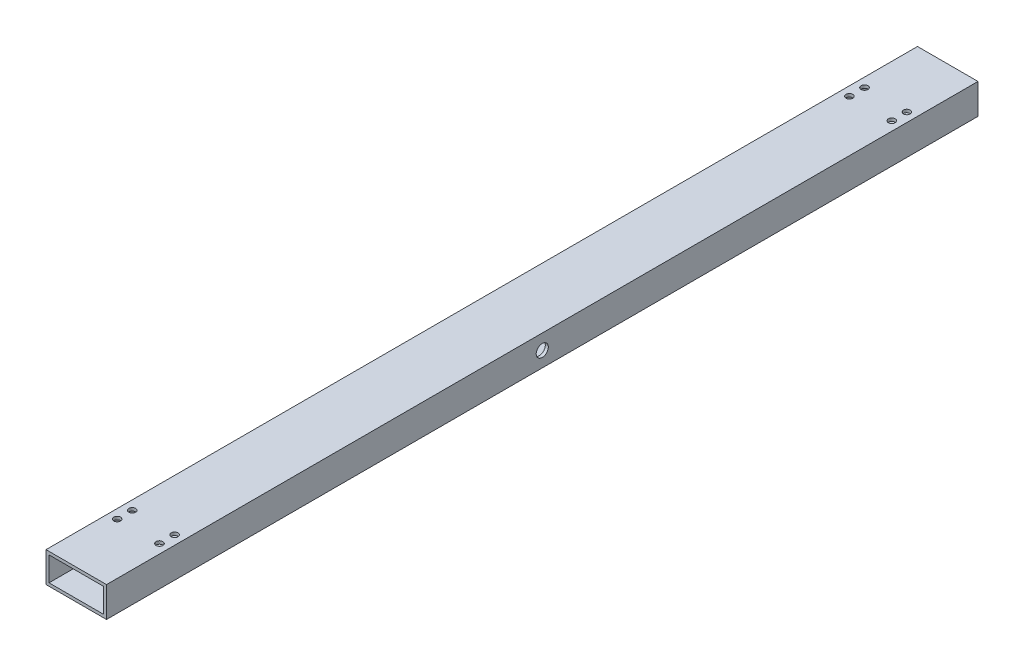
ISO-10303-21;
HEADER;
FILE_DESCRIPTION(('STEP AP214'),'2;1');
FILE_NAME('part.step','',(''),(''),'','','');
FILE_SCHEMA(('AUTOMOTIVE_DESIGN { 1 0 10303 214 1 1 1 1 }'));
ENDSEC;
DATA;
#1=APPLICATION_CONTEXT('core data for automotive mechanical design processes');
#2=APPLICATION_PROTOCOL_DEFINITION('international standard','automotive_design',2000,#1);
#3=PRODUCT_CONTEXT('',#1,'mechanical');
#4=PRODUCT('Part','Part','',(#3));
#5=PRODUCT_RELATED_PRODUCT_CATEGORY('part','',(#4));
#6=PRODUCT_DEFINITION_FORMATION('','',#4);
#7=PRODUCT_DEFINITION_CONTEXT('part definition',#1,'design');
#8=PRODUCT_DEFINITION('design','',#6,#7);
#9=PRODUCT_DEFINITION_SHAPE('','',#8);
#10=(LENGTH_UNIT() NAMED_UNIT(*) SI_UNIT(.MILLI.,.METRE.));
#11=(NAMED_UNIT(*) PLANE_ANGLE_UNIT() SI_UNIT($,.RADIAN.));
#12=(NAMED_UNIT(*) SI_UNIT($,.STERADIAN.) SOLID_ANGLE_UNIT());
#13=UNCERTAINTY_MEASURE_WITH_UNIT(LENGTH_MEASURE(1.E-05),#10,'distance_accuracy_value','');
#14=(GEOMETRIC_REPRESENTATION_CONTEXT(3) GLOBAL_UNCERTAINTY_ASSIGNED_CONTEXT((#13)) GLOBAL_UNIT_ASSIGNED_CONTEXT((#10,
#11,#12)) REPRESENTATION_CONTEXT('',''));
#15=CARTESIAN_POINT('',(0.,0.,0.));
#16=DIRECTION('',(0.,0.,1.));
#17=DIRECTION('',(1.,0.,0.));
#18=AXIS2_PLACEMENT_3D('',#15,#16,#17);
#19=CARTESIAN_POINT('',(-31.7499999999999,15.875,457.2));
#20=DIRECTION('',(0.,-1.,0.));
#21=DIRECTION('',(1.,0.,0.));
#22=AXIS2_PLACEMENT_3D('',#19,#20,#21);
#23=PLANE('',#22);
#24=CARTESIAN_POINT('',(-22.2250000000001,15.875,-376.2375));
#25=DIRECTION('',(0.,-1.,0.));
#26=DIRECTION('',(0.,0.,-1.));
#27=AXIS2_PLACEMENT_3D('',#24,#25,#26);
#28=CIRCLE('',#27,3.57187499999998);
#29=CARTESIAN_POINT('',(-22.2250000000001,15.875,-379.809375));
#30=VERTEX_POINT('',#29);
#31=EDGE_CURVE('E278',#30,#30,#28,.T.);
#32=ORIENTED_EDGE('',*,*,#31,.T.);
#33=EDGE_LOOP('',(#32));
#34=FACE_BOUND('',#33,.T.);
#35=CARTESIAN_POINT('',(22.2249999999999,15.875,392.1125));
#36=DIRECTION('',(0.,-1.,0.));
#37=DIRECTION('',(0.,0.,-1.));
#38=AXIS2_PLACEMENT_3D('',#35,#36,#37);
#39=CIRCLE('',#38,3.57187499999998);
#40=CARTESIAN_POINT('',(22.2249999999999,15.875,388.540625));
#41=VERTEX_POINT('',#40);
#42=EDGE_CURVE('E271',#41,#41,#39,.T.);
#43=ORIENTED_EDGE('',*,*,#42,.T.);
#44=EDGE_LOOP('',(#43));
#45=FACE_BOUND('',#44,.T.);
#46=CARTESIAN_POINT('',(22.2249999999999,15.875,-376.2375));
#47=DIRECTION('',(0.,-1.,0.));
#48=DIRECTION('',(0.,0.,-1.));
#49=AXIS2_PLACEMENT_3D('',#46,#47,#48);
#50=CIRCLE('',#49,3.57187499999998);
#51=CARTESIAN_POINT('',(22.2249999999999,15.875,-379.809375));
#52=VERTEX_POINT('',#51);
#53=EDGE_CURVE('E307',#52,#52,#50,.T.);
#54=ORIENTED_EDGE('',*,*,#53,.T.);
#55=EDGE_LOOP('',(#54));
#56=FACE_BOUND('',#55,.T.);
#57=CARTESIAN_POINT('',(-22.2250000000001,15.875,392.1125));
#58=DIRECTION('',(0.,-1.,0.));
#59=DIRECTION('',(0.,0.,-1.));
#60=AXIS2_PLACEMENT_3D('',#57,#58,#59);
#61=CIRCLE('',#60,3.57187499999998);
#62=CARTESIAN_POINT('',(-22.2250000000001,15.875,388.540625));
#63=VERTEX_POINT('',#62);
#64=EDGE_CURVE('E206',#63,#63,#61,.T.);
#65=ORIENTED_EDGE('',*,*,#64,.T.);
#66=EDGE_LOOP('',(#65));
#67=FACE_BOUND('',#66,.T.);
#68=DIRECTION('',(0.,0.,-1.));
#69=VECTOR('',#68,1.);
#70=CARTESIAN_POINT('',(31.75,15.875,457.2));
#71=LINE('',#70,#69);
#72=CARTESIAN_POINT('',(31.75,15.875,457.2));
#73=VERTEX_POINT('',#72);
#74=CARTESIAN_POINT('',(31.75,15.875,-457.2));
#75=VERTEX_POINT('',#74);
#76=EDGE_CURVE('E11',#73,#75,#71,.T.);
#77=ORIENTED_EDGE('',*,*,#76,.T.);
#78=DIRECTION('',(-1.,0.,0.));
#79=VECTOR('',#78,1.);
#80=CARTESIAN_POINT('',(-31.7499999999999,15.875,-457.2));
#81=LINE('',#80,#79);
#82=CARTESIAN_POINT('',(-31.7499999999999,15.875,-457.2));
#83=VERTEX_POINT('',#82);
#84=EDGE_CURVE('E156',#75,#83,#81,.T.);
#85=ORIENTED_EDGE('',*,*,#84,.T.);
#86=DIRECTION('',(0.,0.,-1.));
#87=VECTOR('',#86,1.);
#88=CARTESIAN_POINT('',(-31.7499999999999,15.875,457.2));
#89=LINE('',#88,#87);
#90=CARTESIAN_POINT('',(-31.7499999999999,15.875,457.2));
#91=VERTEX_POINT('',#90);
#92=EDGE_CURVE('E50',#91,#83,#89,.T.);
#93=ORIENTED_EDGE('',*,*,#92,.F.);
#94=DIRECTION('',(-1.,0.,0.));
#95=VECTOR('',#94,1.);
#96=CARTESIAN_POINT('',(-31.7499999999999,15.875,457.2));
#97=LINE('',#96,#95);
#98=EDGE_CURVE('E185',#73,#91,#97,.T.);
#99=ORIENTED_EDGE('',*,*,#98,.F.);
#100=EDGE_LOOP('',(#77,#85,#93,#99));
#101=FACE_BOUND('',#100,.T.);
#102=CARTESIAN_POINT('',(-22.2250000000001,15.875,376.2375));
#103=DIRECTION('',(0.,1.,0.));
#104=DIRECTION('',(0.,0.,1.));
#105=AXIS2_PLACEMENT_3D('',#102,#103,#104);
#106=CIRCLE('',#105,3.57187499999998);
#107=CARTESIAN_POINT('',(-22.2250000000001,15.875,379.809375));
#108=VERTEX_POINT('',#107);
#109=EDGE_CURVE('E290',#108,#108,#106,.T.);
#110=ORIENTED_EDGE('',*,*,#109,.F.);
#111=EDGE_LOOP('',(#110));
#112=FACE_BOUND('',#111,.T.);
#113=CARTESIAN_POINT('',(22.2249999999999,15.875,376.2375));
#114=DIRECTION('',(0.,1.,0.));
#115=DIRECTION('',(0.,0.,1.));
#116=AXIS2_PLACEMENT_3D('',#113,#114,#115);
#117=CIRCLE('',#116,3.57187499999998);
#118=CARTESIAN_POINT('',(22.2249999999999,15.875,379.809375));
#119=VERTEX_POINT('',#118);
#120=EDGE_CURVE('E299',#119,#119,#117,.T.);
#121=ORIENTED_EDGE('',*,*,#120,.F.);
#122=EDGE_LOOP('',(#121));
#123=FACE_BOUND('',#122,.T.);
#124=CARTESIAN_POINT('',(-22.2250000000001,15.875,-392.1125));
#125=DIRECTION('',(0.,1.,0.));
#126=DIRECTION('',(0.,0.,1.));
#127=AXIS2_PLACEMENT_3D('',#124,#125,#126);
#128=CIRCLE('',#127,3.57187499999998);
#129=CARTESIAN_POINT('',(-22.2250000000001,15.875,-388.540625));
#130=VERTEX_POINT('',#129);
#131=EDGE_CURVE('E264',#130,#130,#128,.T.);
#132=ORIENTED_EDGE('',*,*,#131,.F.);
#133=EDGE_LOOP('',(#132));
#134=FACE_BOUND('',#133,.T.);
#135=CARTESIAN_POINT('',(22.2249999999999,15.875,-392.1125));
#136=DIRECTION('',(0.,1.,0.));
#137=DIRECTION('',(0.,0.,1.));
#138=AXIS2_PLACEMENT_3D('',#135,#136,#137);
#139=CIRCLE('',#138,3.57187499999998);
#140=CARTESIAN_POINT('',(22.2249999999999,15.875,-388.540625));
#141=VERTEX_POINT('',#140);
#142=EDGE_CURVE('E285',#141,#141,#139,.T.);
#143=ORIENTED_EDGE('',*,*,#142,.F.);
#144=EDGE_LOOP('',(#143));
#145=FACE_BOUND('',#144,.T.);
#146=ADVANCED_FACE('F40',(#34,#45,#56,#67,#101,#112,#123,#134,#145),#23,.F.);
#147=CARTESIAN_POINT('',(-31.75,-15.875,457.2));
#148=DIRECTION('',(0.,1.,0.));
#149=DIRECTION('',(0.,0.,1.));
#150=AXIS2_PLACEMENT_3D('',#147,#148,#149);
#151=PLANE('',#150);
#152=CARTESIAN_POINT('',(-22.2250000000001,-15.875,-376.2375));
#153=DIRECTION('',(0.,-1.,0.));
#154=DIRECTION('',(0.,0.,-1.));
#155=AXIS2_PLACEMENT_3D('',#152,#153,#154);
#156=CIRCLE('',#155,3.57187499999998);
#157=CARTESIAN_POINT('',(-22.2250000000001,-15.875,-379.809375));
#158=VERTEX_POINT('',#157);
#159=EDGE_CURVE('E281',#158,#158,#156,.T.);
#160=ORIENTED_EDGE('',*,*,#159,.F.);
#161=EDGE_LOOP('',(#160));
#162=FACE_BOUND('',#161,.T.);
#163=CARTESIAN_POINT('',(22.2249999999999,-15.875,392.1125));
#164=DIRECTION('',(0.,-1.,0.));
#165=DIRECTION('',(0.,0.,-1.));
#166=AXIS2_PLACEMENT_3D('',#163,#164,#165);
#167=CIRCLE('',#166,3.57187499999998);
#168=CARTESIAN_POINT('',(22.2249999999999,-15.875,388.540625));
#169=VERTEX_POINT('',#168);
#170=EDGE_CURVE('E260',#169,#169,#167,.T.);
#171=ORIENTED_EDGE('',*,*,#170,.F.);
#172=EDGE_LOOP('',(#171));
#173=FACE_BOUND('',#172,.T.);
#174=CARTESIAN_POINT('',(22.2249999999999,-15.875,-376.2375));
#175=DIRECTION('',(0.,-1.,0.));
#176=DIRECTION('',(0.,0.,-1.));
#177=AXIS2_PLACEMENT_3D('',#174,#175,#176);
#178=CIRCLE('',#177,3.57187499999998);
#179=CARTESIAN_POINT('',(22.2249999999999,-15.875,-379.809375));
#180=VERTEX_POINT('',#179);
#181=EDGE_CURVE('E282',#180,#180,#178,.T.);
#182=ORIENTED_EDGE('',*,*,#181,.F.);
#183=EDGE_LOOP('',(#182));
#184=FACE_BOUND('',#183,.T.);
#185=CARTESIAN_POINT('',(-22.2250000000001,-15.875,392.1125));
#186=DIRECTION('',(0.,-1.,0.));
#187=DIRECTION('',(0.,0.,-1.));
#188=AXIS2_PLACEMENT_3D('',#185,#186,#187);
#189=CIRCLE('',#188,3.57187499999998);
#190=CARTESIAN_POINT('',(-22.2250000000001,-15.875,388.540625));
#191=VERTEX_POINT('',#190);
#192=EDGE_CURVE('E256',#191,#191,#189,.T.);
#193=ORIENTED_EDGE('',*,*,#192,.F.);
#194=EDGE_LOOP('',(#193));
#195=FACE_BOUND('',#194,.T.);
#196=DIRECTION('',(0.,0.,-1.));
#197=VECTOR('',#196,1.);
#198=CARTESIAN_POINT('',(-31.75,-15.875,457.2));
#199=LINE('',#198,#197);
#200=CARTESIAN_POINT('',(-31.75,-15.875,457.2));
#201=VERTEX_POINT('',#200);
#202=CARTESIAN_POINT('',(-31.75,-15.875,-457.2));
#203=VERTEX_POINT('',#202);
#204=EDGE_CURVE('E196',#201,#203,#199,.T.);
#205=ORIENTED_EDGE('',*,*,#204,.T.);
#206=DIRECTION('',(1.,0.,0.));
#207=VECTOR('',#206,1.);
#208=CARTESIAN_POINT('',(-31.75,-15.875,-457.2));
#209=LINE('',#208,#207);
#210=CARTESIAN_POINT('',(31.75,-15.875,-457.2));
#211=VERTEX_POINT('',#210);
#212=EDGE_CURVE('E162',#203,#211,#209,.T.);
#213=ORIENTED_EDGE('',*,*,#212,.T.);
#214=DIRECTION('',(0.,0.,-1.));
#215=VECTOR('',#214,1.);
#216=CARTESIAN_POINT('',(31.75,-15.875,457.2));
#217=LINE('',#216,#215);
#218=CARTESIAN_POINT('',(31.75,-15.875,457.2));
#219=VERTEX_POINT('',#218);
#220=EDGE_CURVE('E193',#219,#211,#217,.T.);
#221=ORIENTED_EDGE('',*,*,#220,.F.);
#222=DIRECTION('',(1.,0.,0.));
#223=VECTOR('',#222,1.);
#224=CARTESIAN_POINT('',(-31.75,-15.875,457.2));
#225=LINE('',#224,#223);
#226=EDGE_CURVE('E72',#201,#219,#225,.T.);
#227=ORIENTED_EDGE('',*,*,#226,.F.);
#228=EDGE_LOOP('',(#205,#213,#221,#227));
#229=FACE_BOUND('',#228,.T.);
#230=CARTESIAN_POINT('',(-22.2250000000001,-15.875,376.2375));
#231=DIRECTION('',(0.,1.,0.));
#232=DIRECTION('',(0.,0.,1.));
#233=AXIS2_PLACEMENT_3D('',#230,#231,#232);
#234=CIRCLE('',#233,3.57187499999998);
#235=CARTESIAN_POINT('',(-22.2250000000001,-15.875,379.809375));
#236=VERTEX_POINT('',#235);
#237=EDGE_CURVE('E294',#236,#236,#234,.T.);
#238=ORIENTED_EDGE('',*,*,#237,.T.);
#239=EDGE_LOOP('',(#238));
#240=FACE_BOUND('',#239,.T.);
#241=CARTESIAN_POINT('',(22.2249999999999,-15.875,376.2375));
#242=DIRECTION('',(0.,1.,0.));
#243=DIRECTION('',(0.,0.,1.));
#244=AXIS2_PLACEMENT_3D('',#241,#242,#243);
#245=CIRCLE('',#244,3.57187499999998);
#246=CARTESIAN_POINT('',(22.2249999999999,-15.875,379.809375));
#247=VERTEX_POINT('',#246);
#248=EDGE_CURVE('E303',#247,#247,#245,.T.);
#249=ORIENTED_EDGE('',*,*,#248,.T.);
#250=EDGE_LOOP('',(#249));
#251=FACE_BOUND('',#250,.T.);
#252=CARTESIAN_POINT('',(-22.2250000000001,-15.875,-392.1125));
#253=DIRECTION('',(0.,1.,0.));
#254=DIRECTION('',(0.,0.,1.));
#255=AXIS2_PLACEMENT_3D('',#252,#253,#254);
#256=CIRCLE('',#255,3.57187499999998);
#257=CARTESIAN_POINT('',(-22.2250000000001,-15.875,-388.540625));
#258=VERTEX_POINT('',#257);
#259=EDGE_CURVE('E267',#258,#258,#256,.T.);
#260=ORIENTED_EDGE('',*,*,#259,.T.);
#261=EDGE_LOOP('',(#260));
#262=FACE_BOUND('',#261,.T.);
#263=CARTESIAN_POINT('',(22.2249999999999,-15.875,-392.1125));
#264=DIRECTION('',(0.,1.,0.));
#265=DIRECTION('',(0.,0.,1.));
#266=AXIS2_PLACEMENT_3D('',#263,#264,#265);
#267=CIRCLE('',#266,3.57187499999998);
#268=CARTESIAN_POINT('',(22.2249999999999,-15.875,-388.540625));
#269=VERTEX_POINT('',#268);
#270=EDGE_CURVE('E268',#269,#269,#267,.T.);
#271=ORIENTED_EDGE('',*,*,#270,.T.);
#272=EDGE_LOOP('',(#271));
#273=FACE_BOUND('',#272,.T.);
#274=ADVANCED_FACE('F354',(#162,#173,#184,#195,#229,#240,#251,#262,#273),#151,.F.);
#275=CARTESIAN_POINT('',(-28.575,12.7,457.2));
#276=DIRECTION('',(0.,-1.,0.));
#277=DIRECTION('',(0.,0.,-1.));
#278=AXIS2_PLACEMENT_3D('',#275,#276,#277);
#279=PLANE('',#278);
#280=CARTESIAN_POINT('',(-22.2250000000001,12.7,-376.2375));
#281=DIRECTION('',(0.,-1.,0.));
#282=DIRECTION('',(0.,0.,-1.));
#283=AXIS2_PLACEMENT_3D('',#280,#281,#282);
#284=CIRCLE('',#283,3.57187499999998);
#285=CARTESIAN_POINT('',(-22.2250000000001,12.7,-379.809375));
#286=VERTEX_POINT('',#285);
#287=EDGE_CURVE('E144',#286,#286,#284,.T.);
#288=ORIENTED_EDGE('',*,*,#287,.F.);
#289=EDGE_LOOP('',(#288));
#290=FACE_BOUND('',#289,.T.);
#291=CARTESIAN_POINT('',(-22.2250000000001,12.7,-392.1125));
#292=DIRECTION('',(0.,-1.,0.));
#293=DIRECTION('',(0.,0.,-1.));
#294=AXIS2_PLACEMENT_3D('',#291,#292,#293);
#295=CIRCLE('',#294,3.57187499999998);
#296=CARTESIAN_POINT('',(-22.2250000000001,12.7,-395.684375));
#297=VERTEX_POINT('',#296);
#298=EDGE_CURVE('E229',#297,#297,#295,.F.);
#299=ORIENTED_EDGE('',*,*,#298,.T.);
#300=EDGE_LOOP('',(#299));
#301=FACE_BOUND('',#300,.T.);
#302=CARTESIAN_POINT('',(22.2249999999999,12.7,392.1125));
#303=DIRECTION('',(0.,-1.,0.));
#304=DIRECTION('',(0.,0.,-1.));
#305=AXIS2_PLACEMENT_3D('',#302,#303,#304);
#306=CIRCLE('',#305,3.57187499999998);
#307=CARTESIAN_POINT('',(22.2249999999999,12.7,388.540625));
#308=VERTEX_POINT('',#307);
#309=EDGE_CURVE('E225',#308,#308,#306,.T.);
#310=ORIENTED_EDGE('',*,*,#309,.F.);
#311=EDGE_LOOP('',(#310));
#312=FACE_BOUND('',#311,.T.);
#313=CARTESIAN_POINT('',(22.2249999999999,12.7,-376.2375));
#314=DIRECTION('',(0.,-1.,0.));
#315=DIRECTION('',(0.,0.,-1.));
#316=AXIS2_PLACEMENT_3D('',#313,#314,#315);
#317=CIRCLE('',#316,3.57187499999998);
#318=CARTESIAN_POINT('',(22.2249999999999,12.7,-379.809375));
#319=VERTEX_POINT('',#318);
#320=EDGE_CURVE('E220',#319,#319,#317,.T.);
#321=ORIENTED_EDGE('',*,*,#320,.F.);
#322=EDGE_LOOP('',(#321));
#323=FACE_BOUND('',#322,.T.);
#324=CARTESIAN_POINT('',(-22.2250000000001,12.7,376.2375));
#325=DIRECTION('',(0.,-1.,0.));
#326=DIRECTION('',(0.,0.,-1.));
#327=AXIS2_PLACEMENT_3D('',#324,#325,#326);
#328=CIRCLE('',#327,3.57187499999998);
#329=CARTESIAN_POINT('',(-22.2250000000001,12.7,372.665625));
#330=VERTEX_POINT('',#329);
#331=EDGE_CURVE('E211',#330,#330,#328,.F.);
#332=ORIENTED_EDGE('',*,*,#331,.T.);
#333=EDGE_LOOP('',(#332));
#334=FACE_BOUND('',#333,.T.);
#335=CARTESIAN_POINT('',(-22.2250000000001,12.7,392.1125));
#336=DIRECTION('',(0.,-1.,0.));
#337=DIRECTION('',(0.,0.,-1.));
#338=AXIS2_PLACEMENT_3D('',#335,#336,#337);
#339=CIRCLE('',#338,3.57187499999998);
#340=CARTESIAN_POINT('',(-22.2250000000001,12.7,388.540625));
#341=VERTEX_POINT('',#340);
#342=EDGE_CURVE('E205',#341,#341,#339,.T.);
#343=ORIENTED_EDGE('',*,*,#342,.F.);
#344=EDGE_LOOP('',(#343));
#345=FACE_BOUND('',#344,.T.);
#346=DIRECTION('',(0.,0.,-1.));
#347=VECTOR('',#346,1.);
#348=CARTESIAN_POINT('',(-28.575,12.7,457.2));
#349=LINE('',#348,#347);
#350=CARTESIAN_POINT('',(-28.575,12.7,457.2));
#351=VERTEX_POINT('',#350);
#352=CARTESIAN_POINT('',(-28.575,12.7,-457.2));
#353=VERTEX_POINT('',#352);
#354=EDGE_CURVE('E129',#351,#353,#349,.T.);
#355=ORIENTED_EDGE('',*,*,#354,.T.);
#356=DIRECTION('',(-1.,0.,0.));
#357=VECTOR('',#356,1.);
#358=CARTESIAN_POINT('',(-28.575,12.7,-457.2));
#359=LINE('',#358,#357);
#360=CARTESIAN_POINT('',(28.575,12.7,-457.2));
#361=VERTEX_POINT('',#360);
#362=EDGE_CURVE('E132',#361,#353,#359,.T.);
#363=ORIENTED_EDGE('',*,*,#362,.F.);
#364=DIRECTION('',(0.,0.,-1.));
#365=VECTOR('',#364,1.);
#366=CARTESIAN_POINT('',(28.575,12.7,457.2));
#367=LINE('',#366,#365);
#368=CARTESIAN_POINT('',(28.575,12.7,457.2));
#369=VERTEX_POINT('',#368);
#370=EDGE_CURVE('E116',#369,#361,#367,.T.);
#371=ORIENTED_EDGE('',*,*,#370,.F.);
#372=DIRECTION('',(-1.,0.,0.));
#373=VECTOR('',#372,1.);
#374=CARTESIAN_POINT('',(-28.575,12.7,457.2));
#375=LINE('',#374,#373);
#376=EDGE_CURVE('E167',#369,#351,#375,.T.);
#377=ORIENTED_EDGE('',*,*,#376,.T.);
#378=EDGE_LOOP('',(#355,#363,#371,#377));
#379=FACE_BOUND('',#378,.T.);
#380=CARTESIAN_POINT('',(22.2249999999999,12.7,376.2375));
#381=DIRECTION('',(0.,-1.,0.));
#382=DIRECTION('',(0.,0.,-1.));
#383=AXIS2_PLACEMENT_3D('',#380,#381,#382);
#384=CIRCLE('',#383,3.57187499999998);
#385=CARTESIAN_POINT('',(22.2249999999999,12.7,372.665625));
#386=VERTEX_POINT('',#385);
#387=EDGE_CURVE('E216',#386,#386,#384,.F.);
#388=ORIENTED_EDGE('',*,*,#387,.T.);
#389=EDGE_LOOP('',(#388));
#390=FACE_BOUND('',#389,.T.);
#391=CARTESIAN_POINT('',(22.2249999999999,12.7,-392.1125));
#392=DIRECTION('',(0.,-1.,0.));
#393=DIRECTION('',(0.,0.,-1.));
#394=AXIS2_PLACEMENT_3D('',#391,#392,#393);
#395=CIRCLE('',#394,3.57187499999998);
#396=CARTESIAN_POINT('',(22.2249999999999,12.7,-395.684375));
#397=VERTEX_POINT('',#396);
#398=EDGE_CURVE('E232',#397,#397,#395,.F.);
#399=ORIENTED_EDGE('',*,*,#398,.T.);
#400=EDGE_LOOP('',(#399));
#401=FACE_BOUND('',#400,.T.);
#402=ADVANCED_FACE('F133',(#290,#301,#312,#323,#334,#345,#379,#390,#401),#279,.T.);
#403=CARTESIAN_POINT('',(-28.575,-12.7,457.2));
#404=DIRECTION('',(0.,1.,0.));
#405=DIRECTION('',(0.,0.,1.));
#406=AXIS2_PLACEMENT_3D('',#403,#404,#405);
#407=PLANE('',#406);
#408=CARTESIAN_POINT('',(-22.2250000000001,-12.7,-376.2375));
#409=DIRECTION('',(0.,1.,0.));
#410=DIRECTION('',(0.,0.,1.));
#411=AXIS2_PLACEMENT_3D('',#408,#409,#410);
#412=CIRCLE('',#411,3.57187499999998);
#413=CARTESIAN_POINT('',(-22.2250000000001,-12.7,-372.665625));
#414=VERTEX_POINT('',#413);
#415=EDGE_CURVE('E147',#414,#414,#412,.T.);
#416=ORIENTED_EDGE('',*,*,#415,.F.);
#417=EDGE_LOOP('',(#416));
#418=FACE_BOUND('',#417,.T.);
#419=CARTESIAN_POINT('',(-22.2250000000001,-12.7,-392.1125));
#420=DIRECTION('',(0.,1.,0.));
#421=DIRECTION('',(0.,0.,1.));
#422=AXIS2_PLACEMENT_3D('',#419,#420,#421);
#423=CIRCLE('',#422,3.57187499999998);
#424=CARTESIAN_POINT('',(-22.2250000000001,-12.7,-388.540625));
#425=VERTEX_POINT('',#424);
#426=EDGE_CURVE('E226',#425,#425,#423,.F.);
#427=ORIENTED_EDGE('',*,*,#426,.T.);
#428=EDGE_LOOP('',(#427));
#429=FACE_BOUND('',#428,.T.);
#430=CARTESIAN_POINT('',(22.2249999999999,-12.7,392.1125));
#431=DIRECTION('',(0.,1.,0.));
#432=DIRECTION('',(0.,0.,1.));
#433=AXIS2_PLACEMENT_3D('',#430,#431,#432);
#434=CIRCLE('',#433,3.57187499999998);
#435=CARTESIAN_POINT('',(22.2249999999999,-12.7,395.684375));
#436=VERTEX_POINT('',#435);
#437=EDGE_CURVE('E221',#436,#436,#434,.T.);
#438=ORIENTED_EDGE('',*,*,#437,.F.);
#439=EDGE_LOOP('',(#438));
#440=FACE_BOUND('',#439,.T.);
#441=CARTESIAN_POINT('',(22.2249999999999,-12.7,-376.2375));
#442=DIRECTION('',(0.,1.,0.));
#443=DIRECTION('',(0.,0.,1.));
#444=AXIS2_PLACEMENT_3D('',#441,#442,#443);
#445=CIRCLE('',#444,3.57187499999998);
#446=CARTESIAN_POINT('',(22.2249999999999,-12.7,-372.665625));
#447=VERTEX_POINT('',#446);
#448=EDGE_CURVE('E217',#447,#447,#445,.T.);
#449=ORIENTED_EDGE('',*,*,#448,.F.);
#450=EDGE_LOOP('',(#449));
#451=FACE_BOUND('',#450,.T.);
#452=CARTESIAN_POINT('',(-22.2250000000001,-12.7,376.2375));
#453=DIRECTION('',(0.,1.,0.));
#454=DIRECTION('',(0.,0.,1.));
#455=AXIS2_PLACEMENT_3D('',#452,#453,#454);
#456=CIRCLE('',#455,3.57187499999998);
#457=CARTESIAN_POINT('',(-22.2250000000001,-12.7,379.809375));
#458=VERTEX_POINT('',#457);
#459=EDGE_CURVE('E207',#458,#458,#456,.F.);
#460=ORIENTED_EDGE('',*,*,#459,.T.);
#461=EDGE_LOOP('',(#460));
#462=FACE_BOUND('',#461,.T.);
#463=CARTESIAN_POINT('',(-22.2250000000001,-12.7,392.1125));
#464=DIRECTION('',(0.,1.,0.));
#465=DIRECTION('',(0.,0.,1.));
#466=AXIS2_PLACEMENT_3D('',#463,#464,#465);
#467=CIRCLE('',#466,3.57187499999998);
#468=CARTESIAN_POINT('',(-22.2250000000001,-12.7,395.684375));
#469=VERTEX_POINT('',#468);
#470=EDGE_CURVE('E201',#469,#469,#467,.T.);
#471=ORIENTED_EDGE('',*,*,#470,.F.);
#472=EDGE_LOOP('',(#471));
#473=FACE_BOUND('',#472,.T.);
#474=DIRECTION('',(0.,0.,-1.));
#475=VECTOR('',#474,1.);
#476=CARTESIAN_POINT('',(28.575,-12.7,457.2));
#477=LINE('',#476,#475);
#478=CARTESIAN_POINT('',(28.575,-12.7,457.2));
#479=VERTEX_POINT('',#478);
#480=CARTESIAN_POINT('',(28.575,-12.7,-457.2));
#481=VERTEX_POINT('',#480);
#482=EDGE_CURVE('E176',#479,#481,#477,.T.);
#483=ORIENTED_EDGE('',*,*,#482,.T.);
#484=DIRECTION('',(1.,0.,0.));
#485=VECTOR('',#484,1.);
#486=CARTESIAN_POINT('',(-28.575,-12.7,-457.2));
#487=LINE('',#486,#485);
#488=CARTESIAN_POINT('',(-28.575,-12.7,-457.2));
#489=VERTEX_POINT('',#488);
#490=EDGE_CURVE('E143',#489,#481,#487,.T.);
#491=ORIENTED_EDGE('',*,*,#490,.F.);
#492=DIRECTION('',(0.,0.,-1.));
#493=VECTOR('',#492,1.);
#494=CARTESIAN_POINT('',(-28.575,-12.7,457.2));
#495=LINE('',#494,#493);
#496=CARTESIAN_POINT('',(-28.575,-12.7,457.2));
#497=VERTEX_POINT('',#496);
#498=EDGE_CURVE('E61',#497,#489,#495,.T.);
#499=ORIENTED_EDGE('',*,*,#498,.F.);
#500=DIRECTION('',(1.,0.,0.));
#501=VECTOR('',#500,1.);
#502=CARTESIAN_POINT('',(-28.575,-12.7,457.2));
#503=LINE('',#502,#501);
#504=EDGE_CURVE('E173',#497,#479,#503,.T.);
#505=ORIENTED_EDGE('',*,*,#504,.T.);
#506=EDGE_LOOP('',(#483,#491,#499,#505));
#507=FACE_BOUND('',#506,.T.);
#508=CARTESIAN_POINT('',(22.2249999999999,-12.7,376.2375));
#509=DIRECTION('',(0.,1.,0.));
#510=DIRECTION('',(0.,0.,1.));
#511=AXIS2_PLACEMENT_3D('',#508,#509,#510);
#512=CIRCLE('',#511,3.57187499999998);
#513=CARTESIAN_POINT('',(22.2249999999999,-12.7,379.809375));
#514=VERTEX_POINT('',#513);
#515=EDGE_CURVE('E212',#514,#514,#512,.F.);
#516=ORIENTED_EDGE('',*,*,#515,.T.);
#517=EDGE_LOOP('',(#516));
#518=FACE_BOUND('',#517,.T.);
#519=CARTESIAN_POINT('',(22.2249999999999,-12.7,-392.1125));
#520=DIRECTION('',(0.,1.,0.));
#521=DIRECTION('',(0.,0.,1.));
#522=AXIS2_PLACEMENT_3D('',#519,#520,#521);
#523=CIRCLE('',#522,3.57187499999998);
#524=CARTESIAN_POINT('',(22.2249999999999,-12.7,-388.540625));
#525=VERTEX_POINT('',#524);
#526=EDGE_CURVE('E230',#525,#525,#523,.F.);
#527=ORIENTED_EDGE('',*,*,#526,.T.);
#528=EDGE_LOOP('',(#527));
#529=FACE_BOUND('',#528,.T.);
#530=ADVANCED_FACE('F337',(#418,#429,#440,#451,#462,#473,#507,#518,#529),#407,.T.);
#531=CARTESIAN_POINT('',(0.,0.,457.2));
#532=DIRECTION('',(0.,0.,1.));
#533=DIRECTION('',(1.,0.,0.));
#534=AXIS2_PLACEMENT_3D('',#531,#532,#533);
#535=PLANE('',#534);
#536=DIRECTION('',(0.,1.,0.));
#537=VECTOR('',#536,1.);
#538=CARTESIAN_POINT('',(31.75,15.875,457.2));
#539=LINE('',#538,#537);
#540=EDGE_CURVE('E128',#219,#73,#539,.T.);
#541=ORIENTED_EDGE('',*,*,#540,.T.);
#542=ORIENTED_EDGE('',*,*,#98,.T.);
#543=DIRECTION('',(0.,-1.,0.));
#544=VECTOR('',#543,1.);
#545=CARTESIAN_POINT('',(-31.7499999999999,15.875,457.2));
#546=LINE('',#545,#544);
#547=EDGE_CURVE('E188',#91,#201,#546,.T.);
#548=ORIENTED_EDGE('',*,*,#547,.T.);
#549=ORIENTED_EDGE('',*,*,#226,.T.);
#550=EDGE_LOOP('',(#541,#542,#548,#549));
#551=FACE_BOUND('',#550,.T.);
#552=ORIENTED_EDGE('',*,*,#376,.F.);
#553=DIRECTION('',(0.,1.,0.));
#554=VECTOR('',#553,1.);
#555=CARTESIAN_POINT('',(28.575,12.7,457.2));
#556=LINE('',#555,#554);
#557=EDGE_CURVE('E124',#479,#369,#556,.T.);
#558=ORIENTED_EDGE('',*,*,#557,.F.);
#559=ORIENTED_EDGE('',*,*,#504,.F.);
#560=DIRECTION('',(0.,-1.,0.));
#561=VECTOR('',#560,1.);
#562=CARTESIAN_POINT('',(-28.575,12.7,457.2));
#563=LINE('',#562,#561);
#564=EDGE_CURVE('E170',#351,#497,#563,.T.);
#565=ORIENTED_EDGE('',*,*,#564,.F.);
#566=EDGE_LOOP('',(#552,#558,#559,#565));
#567=FACE_BOUND('',#566,.T.);
#568=ADVANCED_FACE('F340',(#551,#567),#535,.T.);
#569=CARTESIAN_POINT('',(31.75,15.875,457.2));
#570=DIRECTION('',(-1.,0.,0.));
#571=DIRECTION('',(0.,-1.,0.));
#572=AXIS2_PLACEMENT_3D('',#569,#570,#571);
#573=PLANE('',#572);
#574=CARTESIAN_POINT('',(31.75,0.,0.));
#575=DIRECTION('',(-1.,0.,0.));
#576=DIRECTION('',(0.,-1.,0.));
#577=AXIS2_PLACEMENT_3D('',#574,#575,#576);
#578=CIRCLE('',#577,6.35);
#579=CARTESIAN_POINT('',(31.75,-6.35000000000006,0.));
#580=VERTEX_POINT('',#579);
#581=EDGE_CURVE('E319',#580,#580,#578,.T.);
#582=ORIENTED_EDGE('',*,*,#581,.T.);
#583=EDGE_LOOP('',(#582));
#584=FACE_BOUND('',#583,.T.);
#585=ORIENTED_EDGE('',*,*,#220,.T.);
#586=DIRECTION('',(0.,1.,0.));
#587=VECTOR('',#586,1.);
#588=CARTESIAN_POINT('',(31.75,15.875,-457.2));
#589=LINE('',#588,#587);
#590=EDGE_CURVE('E153',#211,#75,#589,.T.);
#591=ORIENTED_EDGE('',*,*,#590,.T.);
#592=ORIENTED_EDGE('',*,*,#76,.F.);
#593=ORIENTED_EDGE('',*,*,#540,.F.);
#594=EDGE_LOOP('',(#585,#591,#592,#593));
#595=FACE_BOUND('',#594,.T.);
#596=ADVANCED_FACE('F42',(#584,#595),#573,.F.);
#597=CARTESIAN_POINT('',(-31.7499999999999,15.875,457.2));
#598=DIRECTION('',(1.,0.,0.));
#599=DIRECTION('',(0.,1.,0.));
#600=AXIS2_PLACEMENT_3D('',#597,#598,#599);
#601=PLANE('',#600);
#602=CARTESIAN_POINT('',(-31.75,0.,0.));
#603=DIRECTION('',(-1.,0.,0.));
#604=DIRECTION('',(0.,-1.,0.));
#605=AXIS2_PLACEMENT_3D('',#602,#603,#604);
#606=CIRCLE('',#605,6.35);
#607=CARTESIAN_POINT('',(-31.75,-6.34999999999994,0.));
#608=VERTEX_POINT('',#607);
#609=EDGE_CURVE('E315',#608,#608,#606,.T.);
#610=ORIENTED_EDGE('',*,*,#609,.F.);
#611=EDGE_LOOP('',(#610));
#612=FACE_BOUND('',#611,.T.);
#613=ORIENTED_EDGE('',*,*,#92,.T.);
#614=DIRECTION('',(0.,-1.,0.));
#615=VECTOR('',#614,1.);
#616=CARTESIAN_POINT('',(-31.7499999999999,15.875,-457.2));
#617=LINE('',#616,#615);
#618=EDGE_CURVE('E159',#83,#203,#617,.T.);
#619=ORIENTED_EDGE('',*,*,#618,.T.);
#620=ORIENTED_EDGE('',*,*,#204,.F.);
#621=ORIENTED_EDGE('',*,*,#547,.F.);
#622=EDGE_LOOP('',(#613,#619,#620,#621));
#623=FACE_BOUND('',#622,.T.);
#624=ADVANCED_FACE('F347',(#612,#623),#601,.F.);
#625=CARTESIAN_POINT('',(28.575,12.7,457.2));
#626=DIRECTION('',(-1.,0.,0.));
#627=DIRECTION('',(0.,0.,1.));
#628=AXIS2_PLACEMENT_3D('',#625,#626,#627);
#629=PLANE('',#628);
#630=CARTESIAN_POINT('',(28.575,0.,0.));
#631=DIRECTION('',(-1.,0.,0.));
#632=DIRECTION('',(0.,0.,1.));
#633=AXIS2_PLACEMENT_3D('',#630,#631,#632);
#634=CIRCLE('',#633,6.35);
#635=CARTESIAN_POINT('',(28.575,0.,6.35));
#636=VERTEX_POINT('',#635);
#637=EDGE_CURVE('E295',#636,#636,#634,.T.);
#638=ORIENTED_EDGE('',*,*,#637,.F.);
#639=EDGE_LOOP('',(#638));
#640=FACE_BOUND('',#639,.T.);
#641=ORIENTED_EDGE('',*,*,#370,.T.);
#642=DIRECTION('',(0.,1.,0.));
#643=VECTOR('',#642,1.);
#644=CARTESIAN_POINT('',(28.575,12.7,-457.2));
#645=LINE('',#644,#643);
#646=EDGE_CURVE('E121',#481,#361,#645,.T.);
#647=ORIENTED_EDGE('',*,*,#646,.F.);
#648=ORIENTED_EDGE('',*,*,#482,.F.);
#649=ORIENTED_EDGE('',*,*,#557,.T.);
#650=EDGE_LOOP('',(#641,#647,#648,#649));
#651=FACE_BOUND('',#650,.T.);
#652=ADVANCED_FACE('F118',(#640,#651),#629,.T.);
#653=CARTESIAN_POINT('',(-28.575,12.7,457.2));
#654=DIRECTION('',(1.,0.,0.));
#655=DIRECTION('',(0.,0.,-1.));
#656=AXIS2_PLACEMENT_3D('',#653,#654,#655);
#657=PLANE('',#656);
#658=CARTESIAN_POINT('',(-28.575,0.,0.));
#659=DIRECTION('',(1.,0.,0.));
#660=DIRECTION('',(0.,0.,-1.));
#661=AXIS2_PLACEMENT_3D('',#658,#659,#660);
#662=CIRCLE('',#661,6.35);
#663=CARTESIAN_POINT('',(-28.575,0.,-6.35));
#664=VERTEX_POINT('',#663);
#665=EDGE_CURVE('E44',#664,#664,#662,.T.);
#666=ORIENTED_EDGE('',*,*,#665,.F.);
#667=EDGE_LOOP('',(#666));
#668=FACE_BOUND('',#667,.T.);
#669=ORIENTED_EDGE('',*,*,#498,.T.);
#670=DIRECTION('',(0.,-1.,0.));
#671=VECTOR('',#670,1.);
#672=CARTESIAN_POINT('',(-28.575,12.7,-457.2));
#673=LINE('',#672,#671);
#674=EDGE_CURVE('E139',#353,#489,#673,.T.);
#675=ORIENTED_EDGE('',*,*,#674,.F.);
#676=ORIENTED_EDGE('',*,*,#354,.F.);
#677=ORIENTED_EDGE('',*,*,#564,.T.);
#678=EDGE_LOOP('',(#669,#675,#676,#677));
#679=FACE_BOUND('',#678,.T.);
#680=ADVANCED_FACE('F331',(#668,#679),#657,.T.);
#681=CARTESIAN_POINT('',(0.,0.,-457.2));
#682=DIRECTION('',(0.,0.,1.));
#683=DIRECTION('',(1.,0.,0.));
#684=AXIS2_PLACEMENT_3D('',#681,#682,#683);
#685=PLANE('',#684);
#686=ORIENTED_EDGE('',*,*,#490,.T.);
#687=ORIENTED_EDGE('',*,*,#646,.T.);
#688=ORIENTED_EDGE('',*,*,#362,.T.);
#689=ORIENTED_EDGE('',*,*,#674,.T.);
#690=EDGE_LOOP('',(#686,#687,#688,#689));
#691=FACE_BOUND('',#690,.T.);
#692=ORIENTED_EDGE('',*,*,#590,.F.);
#693=ORIENTED_EDGE('',*,*,#212,.F.);
#694=ORIENTED_EDGE('',*,*,#618,.F.);
#695=ORIENTED_EDGE('',*,*,#84,.F.);
#696=EDGE_LOOP('',(#692,#693,#694,#695));
#697=FACE_BOUND('',#696,.T.);
#698=ADVANCED_FACE('F141',(#691,#697),#685,.F.);
#699=CARTESIAN_POINT('',(-22.2250000000001,15.875,392.1125));
#700=DIRECTION('',(0.,-1.,0.));
#701=DIRECTION('',(0.,0.,-1.));
#702=AXIS2_PLACEMENT_3D('',#699,#700,#701);
#703=CYLINDRICAL_SURFACE('',#702,3.57187499999998);
#704=ORIENTED_EDGE('',*,*,#470,.T.);
#705=EDGE_LOOP('',(#704));
#706=FACE_BOUND('',#705,.T.);
#707=ORIENTED_EDGE('',*,*,#192,.T.);
#708=EDGE_LOOP('',(#707));
#709=FACE_BOUND('',#708,.T.);
#710=ADVANCED_FACE('F432',(#706,#709),#703,.F.);
#711=CARTESIAN_POINT('',(-22.2250000000001,15.875,376.2375));
#712=DIRECTION('',(0.,-1.,0.));
#713=DIRECTION('',(0.,0.,-1.));
#714=AXIS2_PLACEMENT_3D('',#711,#712,#713);
#715=CYLINDRICAL_SURFACE('',#714,3.57187499999998);
#716=ORIENTED_EDGE('',*,*,#459,.F.);
#717=EDGE_LOOP('',(#716));
#718=FACE_BOUND('',#717,.T.);
#719=ORIENTED_EDGE('',*,*,#237,.F.);
#720=EDGE_LOOP('',(#719));
#721=FACE_BOUND('',#720,.T.);
#722=ADVANCED_FACE('F435',(#718,#721),#715,.F.);
#723=CARTESIAN_POINT('',(22.2249999999999,15.875,376.2375));
#724=DIRECTION('',(0.,-1.,0.));
#725=DIRECTION('',(0.,0.,-1.));
#726=AXIS2_PLACEMENT_3D('',#723,#724,#725);
#727=CYLINDRICAL_SURFACE('',#726,3.57187499999998);
#728=ORIENTED_EDGE('',*,*,#515,.F.);
#729=EDGE_LOOP('',(#728));
#730=FACE_BOUND('',#729,.T.);
#731=ORIENTED_EDGE('',*,*,#248,.F.);
#732=EDGE_LOOP('',(#731));
#733=FACE_BOUND('',#732,.T.);
#734=ADVANCED_FACE('F467',(#730,#733),#727,.F.);
#735=CARTESIAN_POINT('',(22.2249999999999,15.875,-376.2375));
#736=DIRECTION('',(0.,-1.,0.));
#737=DIRECTION('',(0.,0.,-1.));
#738=AXIS2_PLACEMENT_3D('',#735,#736,#737);
#739=CYLINDRICAL_SURFACE('',#738,3.57187499999998);
#740=ORIENTED_EDGE('',*,*,#448,.T.);
#741=EDGE_LOOP('',(#740));
#742=FACE_BOUND('',#741,.T.);
#743=ORIENTED_EDGE('',*,*,#181,.T.);
#744=EDGE_LOOP('',(#743));
#745=FACE_BOUND('',#744,.T.);
#746=ADVANCED_FACE('F474',(#742,#745),#739,.F.);
#747=CARTESIAN_POINT('',(22.2249999999999,15.875,392.1125));
#748=DIRECTION('',(0.,-1.,0.));
#749=DIRECTION('',(0.,0.,-1.));
#750=AXIS2_PLACEMENT_3D('',#747,#748,#749);
#751=CYLINDRICAL_SURFACE('',#750,3.57187499999998);
#752=ORIENTED_EDGE('',*,*,#437,.T.);
#753=EDGE_LOOP('',(#752));
#754=FACE_BOUND('',#753,.T.);
#755=ORIENTED_EDGE('',*,*,#170,.T.);
#756=EDGE_LOOP('',(#755));
#757=FACE_BOUND('',#756,.T.);
#758=ADVANCED_FACE('F405',(#754,#757),#751,.F.);
#759=CARTESIAN_POINT('',(-22.2250000000001,15.875,-392.1125));
#760=DIRECTION('',(0.,-1.,0.));
#761=DIRECTION('',(0.,0.,-1.));
#762=AXIS2_PLACEMENT_3D('',#759,#760,#761);
#763=CYLINDRICAL_SURFACE('',#762,3.57187499999998);
#764=ORIENTED_EDGE('',*,*,#426,.F.);
#765=EDGE_LOOP('',(#764));
#766=FACE_BOUND('',#765,.T.);
#767=ORIENTED_EDGE('',*,*,#259,.F.);
#768=EDGE_LOOP('',(#767));
#769=FACE_BOUND('',#768,.T.);
#770=ADVANCED_FACE('F394',(#766,#769),#763,.F.);
#771=CARTESIAN_POINT('',(22.2249999999999,15.875,-392.1125));
#772=DIRECTION('',(0.,-1.,0.));
#773=DIRECTION('',(0.,0.,-1.));
#774=AXIS2_PLACEMENT_3D('',#771,#772,#773);
#775=CYLINDRICAL_SURFACE('',#774,3.57187499999998);
#776=ORIENTED_EDGE('',*,*,#526,.F.);
#777=EDGE_LOOP('',(#776));
#778=FACE_BOUND('',#777,.T.);
#779=ORIENTED_EDGE('',*,*,#270,.F.);
#780=EDGE_LOOP('',(#779));
#781=FACE_BOUND('',#780,.T.);
#782=ADVANCED_FACE('F391',(#778,#781),#775,.F.);
#783=CARTESIAN_POINT('',(-22.2250000000001,15.875,-376.2375));
#784=DIRECTION('',(0.,-1.,0.));
#785=DIRECTION('',(0.,0.,-1.));
#786=AXIS2_PLACEMENT_3D('',#783,#784,#785);
#787=CYLINDRICAL_SURFACE('',#786,3.57187499999998);
#788=ORIENTED_EDGE('',*,*,#415,.T.);
#789=EDGE_LOOP('',(#788));
#790=FACE_BOUND('',#789,.T.);
#791=ORIENTED_EDGE('',*,*,#159,.T.);
#792=EDGE_LOOP('',(#791));
#793=FACE_BOUND('',#792,.T.);
#794=ADVANCED_FACE('F393',(#790,#793),#787,.F.);
#795=ORIENTED_EDGE('',*,*,#342,.T.);
#796=EDGE_LOOP('',(#795));
#797=FACE_BOUND('',#796,.T.);
#798=ORIENTED_EDGE('',*,*,#64,.F.);
#799=EDGE_LOOP('',(#798));
#800=FACE_BOUND('',#799,.T.);
#801=ADVANCED_FACE('F402',(#797,#800),#703,.F.);
#802=ORIENTED_EDGE('',*,*,#331,.F.);
#803=EDGE_LOOP('',(#802));
#804=FACE_BOUND('',#803,.T.);
#805=ORIENTED_EDGE('',*,*,#109,.T.);
#806=EDGE_LOOP('',(#805));
#807=FACE_BOUND('',#806,.T.);
#808=ADVANCED_FACE('F454',(#804,#807),#715,.F.);
#809=ORIENTED_EDGE('',*,*,#387,.F.);
#810=EDGE_LOOP('',(#809));
#811=FACE_BOUND('',#810,.T.);
#812=ORIENTED_EDGE('',*,*,#120,.T.);
#813=EDGE_LOOP('',(#812));
#814=FACE_BOUND('',#813,.T.);
#815=ADVANCED_FACE('F460',(#811,#814),#727,.F.);
#816=ORIENTED_EDGE('',*,*,#320,.T.);
#817=EDGE_LOOP('',(#816));
#818=FACE_BOUND('',#817,.T.);
#819=ORIENTED_EDGE('',*,*,#53,.F.);
#820=EDGE_LOOP('',(#819));
#821=FACE_BOUND('',#820,.T.);
#822=ADVANCED_FACE('F426',(#818,#821),#739,.F.);
#823=ORIENTED_EDGE('',*,*,#309,.T.);
#824=EDGE_LOOP('',(#823));
#825=FACE_BOUND('',#824,.T.);
#826=ORIENTED_EDGE('',*,*,#42,.F.);
#827=EDGE_LOOP('',(#826));
#828=FACE_BOUND('',#827,.T.);
#829=ADVANCED_FACE('F418',(#825,#828),#751,.F.);
#830=ORIENTED_EDGE('',*,*,#298,.F.);
#831=EDGE_LOOP('',(#830));
#832=FACE_BOUND('',#831,.T.);
#833=ORIENTED_EDGE('',*,*,#131,.T.);
#834=EDGE_LOOP('',(#833));
#835=FACE_BOUND('',#834,.T.);
#836=ADVANCED_FACE('F408',(#832,#835),#763,.F.);
#837=ORIENTED_EDGE('',*,*,#398,.F.);
#838=EDGE_LOOP('',(#837));
#839=FACE_BOUND('',#838,.T.);
#840=ORIENTED_EDGE('',*,*,#142,.T.);
#841=EDGE_LOOP('',(#840));
#842=FACE_BOUND('',#841,.T.);
#843=ADVANCED_FACE('F397',(#839,#842),#775,.F.);
#844=ORIENTED_EDGE('',*,*,#287,.T.);
#845=EDGE_LOOP('',(#844));
#846=FACE_BOUND('',#845,.T.);
#847=ORIENTED_EDGE('',*,*,#31,.F.);
#848=EDGE_LOOP('',(#847));
#849=FACE_BOUND('',#848,.T.);
#850=ADVANCED_FACE('F404',(#846,#849),#787,.F.);
#851=CARTESIAN_POINT('',(31.75,0.,0.));
#852=DIRECTION('',(-1.,0.,0.));
#853=DIRECTION('',(0.,-1.,0.));
#854=AXIS2_PLACEMENT_3D('',#851,#852,#853);
#855=CYLINDRICAL_SURFACE('',#854,6.35);
#856=ORIENTED_EDGE('',*,*,#665,.T.);
#857=EDGE_LOOP('',(#856));
#858=FACE_BOUND('',#857,.T.);
#859=ORIENTED_EDGE('',*,*,#609,.T.);
#860=EDGE_LOOP('',(#859));
#861=FACE_BOUND('',#860,.T.);
#862=ADVANCED_FACE('F328',(#858,#861),#855,.F.);
#863=ORIENTED_EDGE('',*,*,#637,.T.);
#864=EDGE_LOOP('',(#863));
#865=FACE_BOUND('',#864,.T.);
#866=ORIENTED_EDGE('',*,*,#581,.F.);
#867=EDGE_LOOP('',(#866));
#868=FACE_BOUND('',#867,.T.);
#869=ADVANCED_FACE('F493',(#865,#868),#855,.F.);
#870=CLOSED_SHELL('',(#146,#274,#402,#530,#568,#596,#624,#652,#680,#698,#710,#722,#734,#746,
#758,#770,#782,#794,#801,#808,#815,#822,#829,#836,#843,#850,#862,#869));
#871=MANIFOLD_SOLID_BREP('B2',#870);
#872=ADVANCED_BREP_SHAPE_REPRESENTATION('',(#18,#871),#14);
#873=SHAPE_DEFINITION_REPRESENTATION(#9,#872);
ENDSEC;
END-ISO-10303-21;
